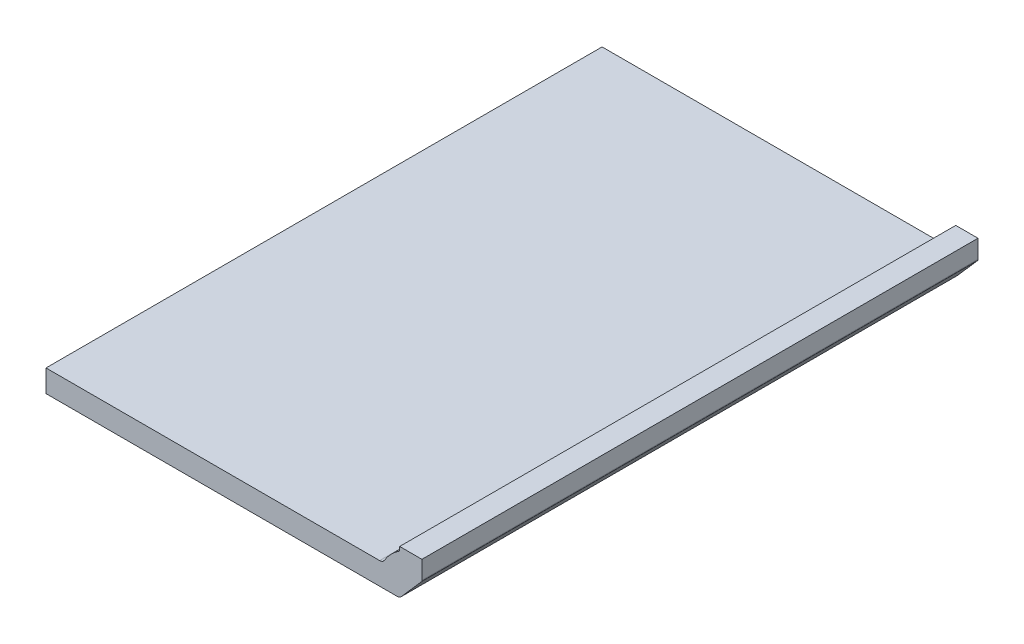
ISO-10303-21;
HEADER;
FILE_DESCRIPTION(('STEP AP214'),'2;1');
FILE_NAME('part.step','',(''),(''),'','','');
FILE_SCHEMA(('AUTOMOTIVE_DESIGN { 1 0 10303 214 1 1 1 1 }'));
ENDSEC;
DATA;
#1=APPLICATION_CONTEXT('core data for automotive mechanical design processes');
#2=APPLICATION_PROTOCOL_DEFINITION('international standard','automotive_design',2000,#1);
#3=PRODUCT_CONTEXT('',#1,'mechanical');
#4=PRODUCT('Part','Part','',(#3));
#5=PRODUCT_RELATED_PRODUCT_CATEGORY('part','',(#4));
#6=PRODUCT_DEFINITION_FORMATION('','',#4);
#7=PRODUCT_DEFINITION_CONTEXT('part definition',#1,'design');
#8=PRODUCT_DEFINITION('design','',#6,#7);
#9=PRODUCT_DEFINITION_SHAPE('','',#8);
#10=(LENGTH_UNIT() NAMED_UNIT(*) SI_UNIT(.MILLI.,.METRE.));
#11=(NAMED_UNIT(*) PLANE_ANGLE_UNIT() SI_UNIT($,.RADIAN.));
#12=(NAMED_UNIT(*) SI_UNIT($,.STERADIAN.) SOLID_ANGLE_UNIT());
#13=UNCERTAINTY_MEASURE_WITH_UNIT(LENGTH_MEASURE(1.E-05),#10,'distance_accuracy_value','');
#14=(GEOMETRIC_REPRESENTATION_CONTEXT(3) GLOBAL_UNCERTAINTY_ASSIGNED_CONTEXT((#13)) GLOBAL_UNIT_ASSIGNED_CONTEXT((#10,
#11,#12)) REPRESENTATION_CONTEXT('',''));
#15=CARTESIAN_POINT('',(0.,0.,0.));
#16=DIRECTION('',(0.,0.,1.));
#17=DIRECTION('',(1.,0.,0.));
#18=AXIS2_PLACEMENT_3D('',#15,#16,#17);
#19=CARTESIAN_POINT('',(-31.8,2.,-50.));
#20=DIRECTION('',(-1.,0.,0.));
#21=DIRECTION('',(0.,0.,1.));
#22=AXIS2_PLACEMENT_3D('',#19,#20,#21);
#23=PLANE('',#22);
#24=DIRECTION('',(0.,-1.,0.));
#25=VECTOR('',#24,1.);
#26=CARTESIAN_POINT('',(-31.8,2.,0.));
#27=LINE('',#26,#25);
#28=CARTESIAN_POINT('',(-31.8,2.,0.));
#29=VERTEX_POINT('',#28);
#30=CARTESIAN_POINT('',(-31.8,0.,0.));
#31=VERTEX_POINT('',#30);
#32=EDGE_CURVE('E154',#29,#31,#27,.T.);
#33=ORIENTED_EDGE('',*,*,#32,.F.);
#34=DIRECTION('',(0.,0.,1.));
#35=VECTOR('',#34,1.);
#36=CARTESIAN_POINT('',(-31.8,2.,-50.));
#37=LINE('',#36,#35);
#38=CARTESIAN_POINT('',(-31.8,2.,-50.));
#39=VERTEX_POINT('',#38);
#40=EDGE_CURVE('E11',#39,#29,#37,.T.);
#41=ORIENTED_EDGE('',*,*,#40,.F.);
#42=DIRECTION('',(0.,-1.,0.));
#43=VECTOR('',#42,1.);
#44=CARTESIAN_POINT('',(-31.8,2.,-50.));
#45=LINE('',#44,#43);
#46=CARTESIAN_POINT('',(-31.8,0.,-50.));
#47=VERTEX_POINT('',#46);
#48=EDGE_CURVE('E186',#39,#47,#45,.T.);
#49=ORIENTED_EDGE('',*,*,#48,.T.);
#50=DIRECTION('',(0.,0.,1.));
#51=VECTOR('',#50,1.);
#52=CARTESIAN_POINT('',(-31.8,0.,-50.));
#53=LINE('',#52,#51);
#54=EDGE_CURVE('E36',#47,#31,#53,.T.);
#55=ORIENTED_EDGE('',*,*,#54,.T.);
#56=EDGE_LOOP('',(#33,#41,#49,#55));
#57=FACE_BOUND('',#56,.T.);
#58=ADVANCED_FACE('F33',(#57),#23,.T.);
#59=CARTESIAN_POINT('',(-31.8,2.,-50.));
#60=DIRECTION('',(0.,1.,0.));
#61=DIRECTION('',(0.,0.,1.));
#62=AXIS2_PLACEMENT_3D('',#59,#60,#61);
#63=PLANE('',#62);
#64=DIRECTION('',(-1.,0.,0.));
#65=VECTOR('',#64,1.);
#66=CARTESIAN_POINT('',(-31.8,2.,0.));
#67=LINE('',#66,#65);
#68=CARTESIAN_POINT('',(-1.79756024970958,2.,0.));
#69=VERTEX_POINT('',#68);
#70=EDGE_CURVE('E184',#69,#29,#67,.T.);
#71=ORIENTED_EDGE('',*,*,#70,.F.);
#72=DIRECTION('',(0.,0.,1.));
#73=VECTOR('',#72,1.);
#74=CARTESIAN_POINT('',(-1.79756024970958,2.,-50.));
#75=LINE('',#74,#73);
#76=CARTESIAN_POINT('',(-1.79756024970958,2.,-50.));
#77=VERTEX_POINT('',#76);
#78=EDGE_CURVE('E42',#77,#69,#75,.T.);
#79=ORIENTED_EDGE('',*,*,#78,.F.);
#80=DIRECTION('',(-1.,0.,0.));
#81=VECTOR('',#80,1.);
#82=CARTESIAN_POINT('',(-31.8,2.,-50.));
#83=LINE('',#82,#81);
#84=EDGE_CURVE('E144',#77,#39,#83,.T.);
#85=ORIENTED_EDGE('',*,*,#84,.T.);
#86=ORIENTED_EDGE('',*,*,#40,.T.);
#87=EDGE_LOOP('',(#71,#79,#85,#86));
#88=FACE_BOUND('',#87,.T.);
#89=ADVANCED_FACE('F206',(#88),#63,.T.);
#90=CARTESIAN_POINT('',(-1.79756024970958,2.5,-50.));
#91=DIRECTION('',(0.,0.,1.));
#92=DIRECTION('',(1.,0.,0.));
#93=AXIS2_PLACEMENT_3D('',#90,#91,#92);
#94=CYLINDRICAL_SURFACE('',#93,0.5);
#95=CARTESIAN_POINT('',(-1.79756024970958,2.5,0.));
#96=DIRECTION('',(0.,0.,-1.));
#97=DIRECTION('',(1.,0.,0.));
#98=AXIS2_PLACEMENT_3D('',#95,#96,#97);
#99=CIRCLE('',#98,0.5);
#100=CARTESIAN_POINT('',(-1.3707310570315,2.23958333333333,0.));
#101=VERTEX_POINT('',#100);
#102=EDGE_CURVE('E131',#101,#69,#99,.T.);
#103=ORIENTED_EDGE('',*,*,#102,.F.);
#104=DIRECTION('',(0.,0.,1.));
#105=VECTOR('',#104,1.);
#106=CARTESIAN_POINT('',(-1.3707310570315,2.23958333333333,-50.));
#107=LINE('',#106,#105);
#108=CARTESIAN_POINT('',(-1.3707310570315,2.23958333333333,-50.));
#109=VERTEX_POINT('',#108);
#110=EDGE_CURVE('E126',#109,#101,#107,.T.);
#111=ORIENTED_EDGE('',*,*,#110,.F.);
#112=CARTESIAN_POINT('',(-1.79756024970958,2.5,-50.));
#113=DIRECTION('',(0.,0.,-1.));
#114=DIRECTION('',(1.,0.,0.));
#115=AXIS2_PLACEMENT_3D('',#112,#113,#114);
#116=CIRCLE('',#115,0.5);
#117=EDGE_CURVE('E129',#109,#77,#116,.T.);
#118=ORIENTED_EDGE('',*,*,#117,.T.);
#119=ORIENTED_EDGE('',*,*,#78,.T.);
#120=EDGE_LOOP('',(#103,#111,#118,#119));
#121=FACE_BOUND('',#120,.T.);
#122=ADVANCED_FACE('F128',(#121),#94,.F.);
#123=CARTESIAN_POINT('',(2.3,0.,-50.));
#124=DIRECTION('',(0.,0.,1.));
#125=DIRECTION('',(1.,0.,0.));
#126=AXIS2_PLACEMENT_3D('',#123,#124,#125);
#127=CYLINDRICAL_SURFACE('',#126,4.3);
#128=CARTESIAN_POINT('',(2.3,0.,0.));
#129=DIRECTION('',(0.,0.,1.));
#130=DIRECTION('',(1.,0.,0.));
#131=AXIS2_PLACEMENT_3D('',#128,#129,#130);
#132=CIRCLE('',#131,4.3);
#133=CARTESIAN_POINT('',(-0.0888888888888889,3.57536150291732,0.));
#134=VERTEX_POINT('',#133);
#135=EDGE_CURVE('E181',#134,#101,#132,.T.);
#136=ORIENTED_EDGE('',*,*,#135,.F.);
#137=DIRECTION('',(0.,0.,1.));
#138=VECTOR('',#137,1.);
#139=CARTESIAN_POINT('',(-0.0888888888888889,3.57536150291732,-50.));
#140=LINE('',#139,#138);
#141=CARTESIAN_POINT('',(-0.0888888888888889,3.57536150291732,-50.));
#142=VERTEX_POINT('',#141);
#143=EDGE_CURVE('E136',#142,#134,#140,.T.);
#144=ORIENTED_EDGE('',*,*,#143,.F.);
#145=CARTESIAN_POINT('',(2.3,0.,-50.));
#146=DIRECTION('',(0.,0.,1.));
#147=DIRECTION('',(1.,0.,0.));
#148=AXIS2_PLACEMENT_3D('',#145,#146,#147);
#149=CIRCLE('',#148,4.3);
#150=EDGE_CURVE('E142',#142,#109,#149,.T.);
#151=ORIENTED_EDGE('',*,*,#150,.T.);
#152=ORIENTED_EDGE('',*,*,#110,.T.);
#153=EDGE_LOOP('',(#136,#144,#151,#152));
#154=FACE_BOUND('',#153,.T.);
#155=ADVANCED_FACE('F146',(#154),#127,.T.);
#156=CARTESIAN_POINT('',(-0.2,3.74165738677394,-50.));
#157=DIRECTION('',(0.,0.,1.));
#158=DIRECTION('',(1.,0.,0.));
#159=AXIS2_PLACEMENT_3D('',#156,#157,#158);
#160=CYLINDRICAL_SURFACE('',#159,0.2);
#161=CARTESIAN_POINT('',(-0.2,3.74165738677394,0.));
#162=DIRECTION('',(0.,0.,-1.));
#163=DIRECTION('',(-1.,0.,0.));
#164=AXIS2_PLACEMENT_3D('',#161,#162,#163);
#165=CIRCLE('',#164,0.2);
#166=CARTESIAN_POINT('',(0.,3.74165738677394,0.));
#167=VERTEX_POINT('',#166);
#168=EDGE_CURVE('E178',#167,#134,#165,.T.);
#169=ORIENTED_EDGE('',*,*,#168,.F.);
#170=DIRECTION('',(0.,0.,1.));
#171=VECTOR('',#170,1.);
#172=CARTESIAN_POINT('',(0.,3.74165738677394,-50.));
#173=LINE('',#172,#171);
#174=CARTESIAN_POINT('',(0.,3.74165738677394,-50.));
#175=VERTEX_POINT('',#174);
#176=EDGE_CURVE('E190',#175,#167,#173,.T.);
#177=ORIENTED_EDGE('',*,*,#176,.F.);
#178=CARTESIAN_POINT('',(-0.2,3.74165738677394,-50.));
#179=DIRECTION('',(0.,0.,-1.));
#180=DIRECTION('',(-1.,0.,0.));
#181=AXIS2_PLACEMENT_3D('',#178,#179,#180);
#182=CIRCLE('',#181,0.2);
#183=EDGE_CURVE('E147',#175,#142,#182,.T.);
#184=ORIENTED_EDGE('',*,*,#183,.T.);
#185=ORIENTED_EDGE('',*,*,#143,.T.);
#186=EDGE_LOOP('',(#169,#177,#184,#185));
#187=FACE_BOUND('',#186,.T.);
#188=ADVANCED_FACE('F219',(#187),#160,.F.);
#189=CARTESIAN_POINT('',(0.,4.,-50.));
#190=DIRECTION('',(-1.,0.,0.));
#191=DIRECTION('',(0.,0.,1.));
#192=AXIS2_PLACEMENT_3D('',#189,#190,#191);
#193=PLANE('',#192);
#194=DIRECTION('',(0.,-1.,0.));
#195=VECTOR('',#194,1.);
#196=CARTESIAN_POINT('',(0.,4.,0.));
#197=LINE('',#196,#195);
#198=CARTESIAN_POINT('',(0.,4.,0.));
#199=VERTEX_POINT('',#198);
#200=EDGE_CURVE('E175',#199,#167,#197,.T.);
#201=ORIENTED_EDGE('',*,*,#200,.F.);
#202=DIRECTION('',(0.,0.,1.));
#203=VECTOR('',#202,1.);
#204=CARTESIAN_POINT('',(0.,4.,-50.));
#205=LINE('',#204,#203);
#206=CARTESIAN_POINT('',(0.,4.,-50.));
#207=VERTEX_POINT('',#206);
#208=EDGE_CURVE('E192',#207,#199,#205,.T.);
#209=ORIENTED_EDGE('',*,*,#208,.F.);
#210=DIRECTION('',(0.,-1.,0.));
#211=VECTOR('',#210,1.);
#212=CARTESIAN_POINT('',(0.,4.,-50.));
#213=LINE('',#212,#211);
#214=EDGE_CURVE('E149',#207,#175,#213,.T.);
#215=ORIENTED_EDGE('',*,*,#214,.T.);
#216=ORIENTED_EDGE('',*,*,#176,.T.);
#217=EDGE_LOOP('',(#201,#209,#215,#216));
#218=FACE_BOUND('',#217,.T.);
#219=ADVANCED_FACE('F222',(#218),#193,.T.);
#220=CARTESIAN_POINT('',(2.,4.,-50.));
#221=DIRECTION('',(0.,1.,0.));
#222=DIRECTION('',(0.,0.,1.));
#223=AXIS2_PLACEMENT_3D('',#220,#221,#222);
#224=PLANE('',#223);
#225=DIRECTION('',(-1.,0.,0.));
#226=VECTOR('',#225,1.);
#227=CARTESIAN_POINT('',(2.,4.,0.));
#228=LINE('',#227,#226);
#229=CARTESIAN_POINT('',(2.,4.,0.));
#230=VERTEX_POINT('',#229);
#231=EDGE_CURVE('E172',#230,#199,#228,.T.);
#232=ORIENTED_EDGE('',*,*,#231,.F.);
#233=DIRECTION('',(0.,0.,1.));
#234=VECTOR('',#233,1.);
#235=CARTESIAN_POINT('',(2.,4.,-50.));
#236=LINE('',#235,#234);
#237=CARTESIAN_POINT('',(2.,4.,-50.));
#238=VERTEX_POINT('',#237);
#239=EDGE_CURVE('E194',#238,#230,#236,.T.);
#240=ORIENTED_EDGE('',*,*,#239,.F.);
#241=DIRECTION('',(-1.,0.,0.));
#242=VECTOR('',#241,1.);
#243=CARTESIAN_POINT('',(2.,4.,-50.));
#244=LINE('',#243,#242);
#245=EDGE_CURVE('E348',#238,#207,#244,.T.);
#246=ORIENTED_EDGE('',*,*,#245,.T.);
#247=ORIENTED_EDGE('',*,*,#208,.T.);
#248=EDGE_LOOP('',(#232,#240,#246,#247));
#249=FACE_BOUND('',#248,.T.);
#250=ADVANCED_FACE('F226',(#249),#224,.T.);
#251=CARTESIAN_POINT('',(2.,2.35563078294051,-50.));
#252=DIRECTION('',(1.,0.,0.));
#253=DIRECTION('',(0.,0.,-1.));
#254=AXIS2_PLACEMENT_3D('',#251,#252,#253);
#255=PLANE('',#254);
#256=DIRECTION('',(0.,1.,0.));
#257=VECTOR('',#256,1.);
#258=CARTESIAN_POINT('',(2.,2.35563078294051,0.));
#259=LINE('',#258,#257);
#260=CARTESIAN_POINT('',(2.,2.35563078294051,0.));
#261=VERTEX_POINT('',#260);
#262=EDGE_CURVE('E169',#261,#230,#259,.T.);
#263=ORIENTED_EDGE('',*,*,#262,.F.);
#264=DIRECTION('',(0.,0.,1.));
#265=VECTOR('',#264,1.);
#266=CARTESIAN_POINT('',(2.,2.35563078294051,-50.));
#267=LINE('',#266,#265);
#268=CARTESIAN_POINT('',(2.,2.35563078294051,-50.));
#269=VERTEX_POINT('',#268);
#270=EDGE_CURVE('E196',#269,#261,#267,.T.);
#271=ORIENTED_EDGE('',*,*,#270,.F.);
#272=DIRECTION('',(0.,1.,0.));
#273=VECTOR('',#272,1.);
#274=CARTESIAN_POINT('',(2.,2.35563078294051,-50.));
#275=LINE('',#274,#273);
#276=EDGE_CURVE('E352',#269,#238,#275,.T.);
#277=ORIENTED_EDGE('',*,*,#276,.T.);
#278=ORIENTED_EDGE('',*,*,#239,.T.);
#279=EDGE_LOOP('',(#263,#271,#277,#278));
#280=FACE_BOUND('',#279,.T.);
#281=ADVANCED_FACE('F230',(#280),#255,.T.);
#282=CARTESIAN_POINT('',(1.8,2.35563078294051,-50.));
#283=DIRECTION('',(0.,0.,1.));
#284=DIRECTION('',(1.,0.,0.));
#285=AXIS2_PLACEMENT_3D('',#282,#283,#284);
#286=CYLINDRICAL_SURFACE('',#285,0.2);
#287=CARTESIAN_POINT('',(1.8,2.35563078294051,0.));
#288=DIRECTION('',(0.,0.,1.));
#289=DIRECTION('',(1.,0.,0.));
#290=AXIS2_PLACEMENT_3D('',#287,#288,#289);
#291=CIRCLE('',#290,0.2);
#292=CARTESIAN_POINT('',(1.95036188231122,2.22375468826135,0.));
#293=VERTEX_POINT('',#292);
#294=EDGE_CURVE('E166',#293,#261,#291,.T.);
#295=ORIENTED_EDGE('',*,*,#294,.F.);
#296=DIRECTION('',(0.,0.,1.));
#297=VECTOR('',#296,1.);
#298=CARTESIAN_POINT('',(1.95036188231122,2.22375468826135,-50.));
#299=LINE('',#298,#297);
#300=CARTESIAN_POINT('',(1.95036188231122,2.22375468826135,-50.));
#301=VERTEX_POINT('',#300);
#302=EDGE_CURVE('E198',#301,#293,#299,.T.);
#303=ORIENTED_EDGE('',*,*,#302,.F.);
#304=CARTESIAN_POINT('',(1.8,2.35563078294051,-50.));
#305=DIRECTION('',(0.,0.,1.));
#306=DIRECTION('',(1.,0.,0.));
#307=AXIS2_PLACEMENT_3D('',#304,#305,#306);
#308=CIRCLE('',#307,0.2);
#309=EDGE_CURVE('E341',#301,#269,#308,.T.);
#310=ORIENTED_EDGE('',*,*,#309,.T.);
#311=ORIENTED_EDGE('',*,*,#270,.T.);
#312=EDGE_LOOP('',(#295,#303,#310,#311));
#313=FACE_BOUND('',#312,.T.);
#314=ADVANCED_FACE('F234',(#313),#286,.T.);
#315=CARTESIAN_POINT('',(0.149371543670396,0.170309763302108,-50.));
#316=DIRECTION('',(0.751809411556112,-0.659380473395787,0.));
#317=DIRECTION('',(0.659380473395787,0.751809411556112,0.));
#318=AXIS2_PLACEMENT_3D('',#315,#316,#317);
#319=PLANE('',#318);
#320=DIRECTION('',(0.659380473395787,0.751809411556112,0.));
#321=VECTOR('',#320,1.);
#322=CARTESIAN_POINT('',(0.149371543670396,0.170309763302108,0.));
#323=LINE('',#322,#321);
#324=CARTESIAN_POINT('',(0.149371543670396,0.170309763302108,0.));
#325=VERTEX_POINT('',#324);
#326=EDGE_CURVE('E163',#325,#293,#323,.T.);
#327=ORIENTED_EDGE('',*,*,#326,.F.);
#328=DIRECTION('',(0.,0.,1.));
#329=VECTOR('',#328,1.);
#330=CARTESIAN_POINT('',(0.149371543670396,0.170309763302108,-50.));
#331=LINE('',#330,#329);
#332=CARTESIAN_POINT('',(0.149371543670396,0.170309763302108,-50.));
#333=VERTEX_POINT('',#332);
#334=EDGE_CURVE('E200',#333,#325,#331,.T.);
#335=ORIENTED_EDGE('',*,*,#334,.F.);
#336=DIRECTION('',(0.659380473395787,0.751809411556112,0.));
#337=VECTOR('',#336,1.);
#338=CARTESIAN_POINT('',(0.149371543670396,0.170309763302108,-50.));
#339=LINE('',#338,#337);
#340=EDGE_CURVE('E337',#333,#301,#339,.T.);
#341=ORIENTED_EDGE('',*,*,#340,.T.);
#342=ORIENTED_EDGE('',*,*,#302,.T.);
#343=EDGE_LOOP('',(#327,#335,#341,#342));
#344=FACE_BOUND('',#343,.T.);
#345=ADVANCED_FACE('F238',(#344),#319,.T.);
#346=CARTESIAN_POINT('',(-0.226533162107662,0.5,-50.));
#347=DIRECTION('',(0.,0.,1.));
#348=DIRECTION('',(1.,0.,0.));
#349=AXIS2_PLACEMENT_3D('',#346,#347,#348);
#350=CYLINDRICAL_SURFACE('',#349,0.5);
#351=CARTESIAN_POINT('',(-0.226533162107662,0.5,0.));
#352=DIRECTION('',(0.,0.,1.));
#353=DIRECTION('',(-1.,0.,0.));
#354=AXIS2_PLACEMENT_3D('',#351,#352,#353);
#355=CIRCLE('',#354,0.5);
#356=CARTESIAN_POINT('',(-0.226533162107664,0.,0.));
#357=VERTEX_POINT('',#356);
#358=EDGE_CURVE('E160',#357,#325,#355,.T.);
#359=ORIENTED_EDGE('',*,*,#358,.F.);
#360=DIRECTION('',(0.,0.,1.));
#361=VECTOR('',#360,1.);
#362=CARTESIAN_POINT('',(-0.226533162107664,0.,-50.));
#363=LINE('',#362,#361);
#364=CARTESIAN_POINT('',(-0.226533162107664,0.,-50.));
#365=VERTEX_POINT('',#364);
#366=EDGE_CURVE('E201',#365,#357,#363,.T.);
#367=ORIENTED_EDGE('',*,*,#366,.F.);
#368=CARTESIAN_POINT('',(-0.226533162107662,0.5,-50.));
#369=DIRECTION('',(0.,0.,1.));
#370=DIRECTION('',(-1.,0.,0.));
#371=AXIS2_PLACEMENT_3D('',#368,#369,#370);
#372=CIRCLE('',#371,0.5);
#373=EDGE_CURVE('E358',#365,#333,#372,.T.);
#374=ORIENTED_EDGE('',*,*,#373,.T.);
#375=ORIENTED_EDGE('',*,*,#334,.T.);
#376=EDGE_LOOP('',(#359,#367,#374,#375));
#377=FACE_BOUND('',#376,.T.);
#378=ADVANCED_FACE('F242',(#377),#350,.T.);
#379=CARTESIAN_POINT('',(-0.226533162107664,0.,-50.));
#380=DIRECTION('',(0.,-1.,0.));
#381=DIRECTION('',(1.,0.,0.));
#382=AXIS2_PLACEMENT_3D('',#379,#380,#381);
#383=PLANE('',#382);
#384=DIRECTION('',(1.,0.,0.));
#385=VECTOR('',#384,1.);
#386=CARTESIAN_POINT('',(-0.226533162107664,0.,0.));
#387=LINE('',#386,#385);
#388=EDGE_CURVE('E157',#31,#357,#387,.T.);
#389=ORIENTED_EDGE('',*,*,#388,.F.);
#390=ORIENTED_EDGE('',*,*,#54,.F.);
#391=DIRECTION('',(1.,0.,0.));
#392=VECTOR('',#391,1.);
#393=CARTESIAN_POINT('',(-0.226533162107664,0.,-50.));
#394=LINE('',#393,#392);
#395=EDGE_CURVE('E360',#47,#365,#394,.T.);
#396=ORIENTED_EDGE('',*,*,#395,.T.);
#397=ORIENTED_EDGE('',*,*,#366,.T.);
#398=EDGE_LOOP('',(#389,#390,#396,#397));
#399=FACE_BOUND('',#398,.T.);
#400=ADVANCED_FACE('F203',(#399),#383,.T.);
#401=CARTESIAN_POINT('',(-0.226533162107662,0.5,-50.));
#402=DIRECTION('',(0.,0.,-1.));
#403=DIRECTION('',(-1.,0.,0.));
#404=AXIS2_PLACEMENT_3D('',#401,#402,#403);
#405=PLANE('',#404);
#406=ORIENTED_EDGE('',*,*,#48,.F.);
#407=ORIENTED_EDGE('',*,*,#84,.F.);
#408=ORIENTED_EDGE('',*,*,#117,.F.);
#409=ORIENTED_EDGE('',*,*,#150,.F.);
#410=ORIENTED_EDGE('',*,*,#183,.F.);
#411=ORIENTED_EDGE('',*,*,#214,.F.);
#412=ORIENTED_EDGE('',*,*,#245,.F.);
#413=ORIENTED_EDGE('',*,*,#276,.F.);
#414=ORIENTED_EDGE('',*,*,#309,.F.);
#415=ORIENTED_EDGE('',*,*,#340,.F.);
#416=ORIENTED_EDGE('',*,*,#373,.F.);
#417=ORIENTED_EDGE('',*,*,#395,.F.);
#418=EDGE_LOOP('',(#406,#407,#408,#409,#410,#411,#412,#413,#414,#415,#416,#417));
#419=FACE_BOUND('',#418,.T.);
#420=ADVANCED_FACE('F140',(#419),#405,.T.);
#421=CARTESIAN_POINT('',(-0.226533162107662,0.5,0.));
#422=DIRECTION('',(0.,0.,-1.));
#423=DIRECTION('',(-1.,0.,0.));
#424=AXIS2_PLACEMENT_3D('',#421,#422,#423);
#425=PLANE('',#424);
#426=ORIENTED_EDGE('',*,*,#32,.T.);
#427=ORIENTED_EDGE('',*,*,#388,.T.);
#428=ORIENTED_EDGE('',*,*,#358,.T.);
#429=ORIENTED_EDGE('',*,*,#326,.T.);
#430=ORIENTED_EDGE('',*,*,#294,.T.);
#431=ORIENTED_EDGE('',*,*,#262,.T.);
#432=ORIENTED_EDGE('',*,*,#231,.T.);
#433=ORIENTED_EDGE('',*,*,#200,.T.);
#434=ORIENTED_EDGE('',*,*,#168,.T.);
#435=ORIENTED_EDGE('',*,*,#135,.T.);
#436=ORIENTED_EDGE('',*,*,#102,.T.);
#437=ORIENTED_EDGE('',*,*,#70,.T.);
#438=EDGE_LOOP('',(#426,#427,#428,#429,#430,#431,#432,#433,#434,#435,#436,#437));
#439=FACE_BOUND('',#438,.T.);
#440=ADVANCED_FACE('F205',(#439),#425,.F.);
#441=CLOSED_SHELL('',(#58,#89,#122,#155,#188,#219,#250,#281,#314,#345,#378,#400,#420,#440));
#442=MANIFOLD_SOLID_BREP('B2',#441);
#443=ADVANCED_BREP_SHAPE_REPRESENTATION('',(#18,#442),#14);
#444=SHAPE_DEFINITION_REPRESENTATION(#9,#443);
ENDSEC;
END-ISO-10303-21;
